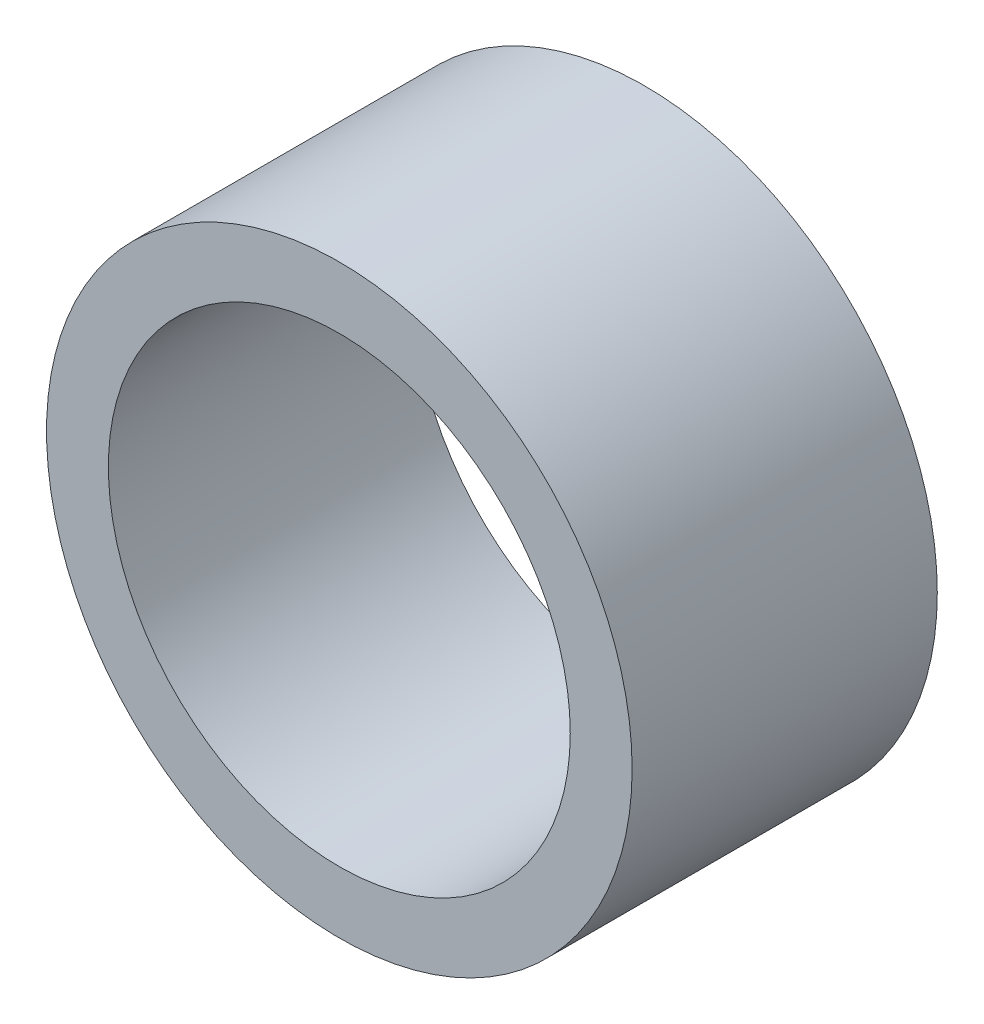
ISO-10303-21;
HEADER;
FILE_DESCRIPTION(('STEP AP214'),'2;1');
FILE_NAME('part.step','',(''),(''),'','','');
FILE_SCHEMA(('AUTOMOTIVE_DESIGN { 1 0 10303 214 1 1 1 1 }'));
ENDSEC;
DATA;
#1=APPLICATION_CONTEXT('core data for automotive mechanical design processes');
#2=APPLICATION_PROTOCOL_DEFINITION('international standard','automotive_design',2000,#1);
#3=PRODUCT_CONTEXT('',#1,'mechanical');
#4=PRODUCT('Part','Part','',(#3));
#5=PRODUCT_RELATED_PRODUCT_CATEGORY('part','',(#4));
#6=PRODUCT_DEFINITION_FORMATION('','',#4);
#7=PRODUCT_DEFINITION_CONTEXT('part definition',#1,'design');
#8=PRODUCT_DEFINITION('design','',#6,#7);
#9=PRODUCT_DEFINITION_SHAPE('','',#8);
#10=(LENGTH_UNIT() NAMED_UNIT(*) SI_UNIT(.MILLI.,.METRE.));
#11=(NAMED_UNIT(*) PLANE_ANGLE_UNIT() SI_UNIT($,.RADIAN.));
#12=(NAMED_UNIT(*) SI_UNIT($,.STERADIAN.) SOLID_ANGLE_UNIT());
#13=UNCERTAINTY_MEASURE_WITH_UNIT(LENGTH_MEASURE(1.E-05),#10,'distance_accuracy_value','');
#14=(GEOMETRIC_REPRESENTATION_CONTEXT(3) GLOBAL_UNCERTAINTY_ASSIGNED_CONTEXT((#13)) GLOBAL_UNIT_ASSIGNED_CONTEXT((#10,
#11,#12)) REPRESENTATION_CONTEXT('',''));
#15=CARTESIAN_POINT('',(0.,0.,0.));
#16=DIRECTION('',(0.,0.,1.));
#17=DIRECTION('',(1.,0.,0.));
#18=AXIS2_PLACEMENT_3D('',#15,#16,#17);
#19=CARTESIAN_POINT('',(0.,0.,18.5));
#20=DIRECTION('',(0.,0.,1.));
#21=DIRECTION('',(1.,0.,0.));
#22=AXIS2_PLACEMENT_3D('',#19,#20,#21);
#23=PLANE('',#22);
#24=CARTESIAN_POINT('',(0.,0.,18.5));
#25=DIRECTION('',(0.,0.,1.));
#26=DIRECTION('',(1.,0.,0.));
#27=AXIS2_PLACEMENT_3D('',#24,#25,#26);
#28=CIRCLE('',#27,17.75);
#29=CARTESIAN_POINT('',(17.75,0.,18.5));
#30=VERTEX_POINT('',#29);
#31=EDGE_CURVE('E10',#30,#30,#28,.T.);
#32=ORIENTED_EDGE('',*,*,#31,.T.);
#33=EDGE_LOOP('',(#32));
#34=FACE_BOUND('',#33,.T.);
#35=CARTESIAN_POINT('',(0.,0.,18.5));
#36=DIRECTION('',(0.,0.,1.));
#37=DIRECTION('',(1.,0.,0.));
#38=AXIS2_PLACEMENT_3D('',#35,#36,#37);
#39=CIRCLE('',#38,14.);
#40=CARTESIAN_POINT('',(14.,0.,18.5));
#41=VERTEX_POINT('',#40);
#42=EDGE_CURVE('E41',#41,#41,#39,.T.);
#43=ORIENTED_EDGE('',*,*,#42,.F.);
#44=EDGE_LOOP('',(#43));
#45=FACE_BOUND('',#44,.T.);
#46=ADVANCED_FACE('F30',(#34,#45),#23,.T.);
#47=CARTESIAN_POINT('',(0.,0.,0.));
#48=DIRECTION('',(0.,0.,1.));
#49=DIRECTION('',(1.,0.,0.));
#50=AXIS2_PLACEMENT_3D('',#47,#48,#49);
#51=PLANE('',#50);
#52=CARTESIAN_POINT('',(0.,0.,0.));
#53=DIRECTION('',(0.,0.,1.));
#54=DIRECTION('',(1.,0.,0.));
#55=AXIS2_PLACEMENT_3D('',#52,#53,#54);
#56=CIRCLE('',#55,17.75);
#57=CARTESIAN_POINT('',(17.75,0.,0.));
#58=VERTEX_POINT('',#57);
#59=EDGE_CURVE('E34',#58,#58,#56,.T.);
#60=ORIENTED_EDGE('',*,*,#59,.F.);
#61=EDGE_LOOP('',(#60));
#62=FACE_BOUND('',#61,.T.);
#63=CARTESIAN_POINT('',(0.,0.,0.));
#64=DIRECTION('',(0.,0.,1.));
#65=DIRECTION('',(1.,0.,0.));
#66=AXIS2_PLACEMENT_3D('',#63,#64,#65);
#67=CIRCLE('',#66,14.);
#68=CARTESIAN_POINT('',(14.,0.,0.));
#69=VERTEX_POINT('',#68);
#70=EDGE_CURVE('E43',#69,#69,#67,.T.);
#71=ORIENTED_EDGE('',*,*,#70,.T.);
#72=EDGE_LOOP('',(#71));
#73=FACE_BOUND('',#72,.T.);
#74=ADVANCED_FACE('F53',(#62,#73),#51,.F.);
#75=CARTESIAN_POINT('',(0.,0.,18.5));
#76=DIRECTION('',(0.,0.,-1.));
#77=DIRECTION('',(-1.,0.,0.));
#78=AXIS2_PLACEMENT_3D('',#75,#76,#77);
#79=CYLINDRICAL_SURFACE('',#78,17.75);
#80=ORIENTED_EDGE('',*,*,#31,.F.);
#81=EDGE_LOOP('',(#80));
#82=FACE_BOUND('',#81,.T.);
#83=ORIENTED_EDGE('',*,*,#59,.T.);
#84=EDGE_LOOP('',(#83));
#85=FACE_BOUND('',#84,.T.);
#86=ADVANCED_FACE('F32',(#82,#85),#79,.T.);
#87=CARTESIAN_POINT('',(0.,0.,18.5));
#88=DIRECTION('',(0.,0.,-1.));
#89=DIRECTION('',(-1.,0.,0.));
#90=AXIS2_PLACEMENT_3D('',#87,#88,#89);
#91=CYLINDRICAL_SURFACE('',#90,14.);
#92=ORIENTED_EDGE('',*,*,#42,.T.);
#93=EDGE_LOOP('',(#92));
#94=FACE_BOUND('',#93,.T.);
#95=ORIENTED_EDGE('',*,*,#70,.F.);
#96=EDGE_LOOP('',(#95));
#97=FACE_BOUND('',#96,.T.);
#98=ADVANCED_FACE('F49',(#94,#97),#91,.F.);
#99=CLOSED_SHELL('',(#46,#74,#86,#98));
#100=MANIFOLD_SOLID_BREP('B2',#99);
#101=ADVANCED_BREP_SHAPE_REPRESENTATION('',(#18,#100),#14);
#102=SHAPE_DEFINITION_REPRESENTATION(#9,#101);
ENDSEC;
END-ISO-10303-21;
